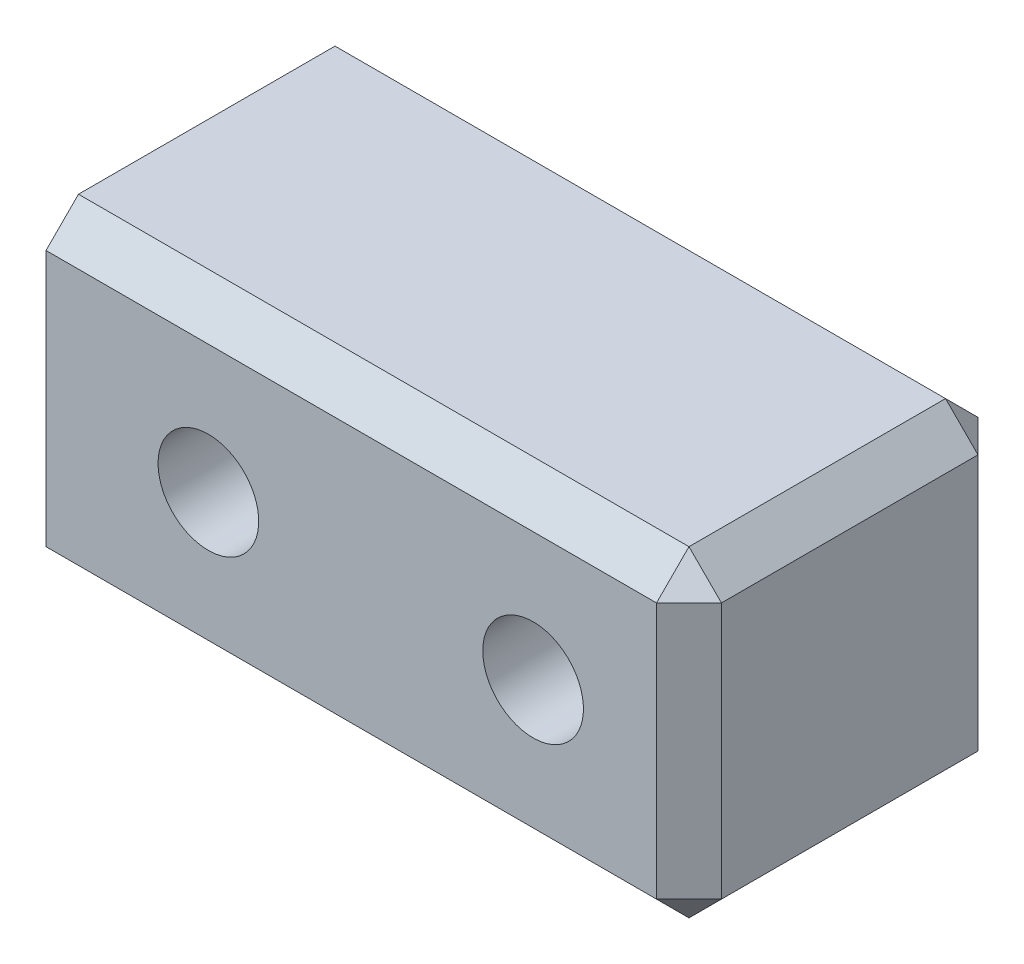
ISO-10303-21;
HEADER;
FILE_DESCRIPTION(('STEP AP214'),'2;1');
FILE_NAME('part.step','',(''),(''),'','','');
FILE_SCHEMA(('AUTOMOTIVE_DESIGN { 1 0 10303 214 1 1 1 1 }'));
ENDSEC;
DATA;
#1=APPLICATION_CONTEXT('core data for automotive mechanical design processes');
#2=APPLICATION_PROTOCOL_DEFINITION('international standard','automotive_design',2000,#1);
#3=PRODUCT_CONTEXT('',#1,'mechanical');
#4=PRODUCT('Part','Part','',(#3));
#5=PRODUCT_RELATED_PRODUCT_CATEGORY('part','',(#4));
#6=PRODUCT_DEFINITION_FORMATION('','',#4);
#7=PRODUCT_DEFINITION_CONTEXT('part definition',#1,'design');
#8=PRODUCT_DEFINITION('design','',#6,#7);
#9=PRODUCT_DEFINITION_SHAPE('','',#8);
#10=(LENGTH_UNIT() NAMED_UNIT(*) SI_UNIT(.MILLI.,.METRE.));
#11=(NAMED_UNIT(*) PLANE_ANGLE_UNIT() SI_UNIT($,.RADIAN.));
#12=(NAMED_UNIT(*) SI_UNIT($,.STERADIAN.) SOLID_ANGLE_UNIT());
#13=UNCERTAINTY_MEASURE_WITH_UNIT(LENGTH_MEASURE(1.E-05),#10,'distance_accuracy_value','');
#14=(GEOMETRIC_REPRESENTATION_CONTEXT(3) GLOBAL_UNCERTAINTY_ASSIGNED_CONTEXT((#13)) GLOBAL_UNIT_ASSIGNED_CONTEXT((#10,
#11,#12)) REPRESENTATION_CONTEXT('',''));
#15=CARTESIAN_POINT('',(0.,0.,0.));
#16=DIRECTION('',(0.,0.,1.));
#17=DIRECTION('',(1.,0.,0.));
#18=AXIS2_PLACEMENT_3D('',#15,#16,#17);
#19=CARTESIAN_POINT('',(0.,0.,9.9));
#20=DIRECTION('',(0.,0.,-1.));
#21=DIRECTION('',(-1.,0.,0.));
#22=AXIS2_PLACEMENT_3D('',#19,#20,#21);
#23=PLANE('',#22);
#24=DIRECTION('',(0.,-1.,0.));
#25=VECTOR('',#24,1.);
#26=CARTESIAN_POINT('',(0.,0.,9.9));
#27=LINE('',#26,#25);
#28=CARTESIAN_POINT('',(0.,8.9,9.9));
#29=VERTEX_POINT('',#28);
#30=CARTESIAN_POINT('',(0.,1.,9.9));
#31=VERTEX_POINT('',#30);
#32=EDGE_CURVE('E182',#29,#31,#27,.T.);
#33=ORIENTED_EDGE('',*,*,#32,.T.);
#34=DIRECTION('',(1.,0.,0.));
#35=VECTOR('',#34,1.);
#36=CARTESIAN_POINT('',(0.,1.,9.9));
#37=LINE('',#36,#35);
#38=CARTESIAN_POINT('',(18.8,1.,9.9));
#39=VERTEX_POINT('',#38);
#40=EDGE_CURVE('E205',#31,#39,#37,.T.);
#41=ORIENTED_EDGE('',*,*,#40,.T.);
#42=DIRECTION('',(0.,1.,0.));
#43=VECTOR('',#42,1.);
#44=CARTESIAN_POINT('',(18.8,0.,9.9));
#45=LINE('',#44,#43);
#46=CARTESIAN_POINT('',(18.8,8.9,9.9));
#47=VERTEX_POINT('',#46);
#48=EDGE_CURVE('E203',#39,#47,#45,.T.);
#49=ORIENTED_EDGE('',*,*,#48,.T.);
#50=DIRECTION('',(-1.,0.,0.));
#51=VECTOR('',#50,1.);
#52=CARTESIAN_POINT('',(0.,8.9,9.9));
#53=LINE('',#52,#51);
#54=EDGE_CURVE('E201',#47,#29,#53,.T.);
#55=ORIENTED_EDGE('',*,*,#54,.T.);
#56=EDGE_LOOP('',(#33,#41,#49,#55));
#57=FACE_BOUND('',#56,.T.);
#58=CARTESIAN_POINT('',(5.,4.95,9.9));
#59=DIRECTION('',(0.,0.,1.));
#60=DIRECTION('',(1.,0.,0.));
#61=AXIS2_PLACEMENT_3D('',#58,#59,#60);
#62=CIRCLE('',#61,1.55);
#63=CARTESIAN_POINT('',(3.45,4.95,9.9));
#64=VERTEX_POINT('',#63);
#65=EDGE_CURVE('E176',#64,#64,#62,.T.);
#66=ORIENTED_EDGE('',*,*,#65,.F.);
#67=EDGE_LOOP('',(#66));
#68=FACE_BOUND('',#67,.T.);
#69=CARTESIAN_POINT('',(15.,4.95,9.9));
#70=DIRECTION('',(0.,0.,1.));
#71=DIRECTION('',(1.,0.,0.));
#72=AXIS2_PLACEMENT_3D('',#69,#70,#71);
#73=CIRCLE('',#72,1.55);
#74=CARTESIAN_POINT('',(13.45,4.95,9.9));
#75=VERTEX_POINT('',#74);
#76=EDGE_CURVE('E168',#75,#75,#73,.T.);
#77=ORIENTED_EDGE('',*,*,#76,.F.);
#78=EDGE_LOOP('',(#77));
#79=FACE_BOUND('',#78,.T.);
#80=ADVANCED_FACE('F43',(#57,#68,#79),#23,.F.);
#81=CARTESIAN_POINT('',(0.,0.,0.));
#82=DIRECTION('',(0.,0.,-1.));
#83=DIRECTION('',(-1.,0.,0.));
#84=AXIS2_PLACEMENT_3D('',#81,#82,#83);
#85=PLANE('',#84);
#86=CARTESIAN_POINT('',(5.,4.95,0.));
#87=DIRECTION('',(0.,0.,1.));
#88=DIRECTION('',(1.,0.,0.));
#89=AXIS2_PLACEMENT_3D('',#86,#87,#88);
#90=CIRCLE('',#89,1.55);
#91=CARTESIAN_POINT('',(3.45,4.95,0.));
#92=VERTEX_POINT('',#91);
#93=EDGE_CURVE('E173',#92,#92,#90,.T.);
#94=ORIENTED_EDGE('',*,*,#93,.T.);
#95=EDGE_LOOP('',(#94));
#96=FACE_BOUND('',#95,.T.);
#97=DIRECTION('',(0.,-1.,0.));
#98=VECTOR('',#97,1.);
#99=CARTESIAN_POINT('',(18.8,0.,0.));
#100=LINE('',#99,#98);
#101=CARTESIAN_POINT('',(18.8,8.9,0.));
#102=VERTEX_POINT('',#101);
#103=CARTESIAN_POINT('',(18.8,1.,0.));
#104=VERTEX_POINT('',#103);
#105=EDGE_CURVE('E152',#102,#104,#100,.T.);
#106=ORIENTED_EDGE('',*,*,#105,.T.);
#107=DIRECTION('',(-1.,0.,0.));
#108=VECTOR('',#107,1.);
#109=CARTESIAN_POINT('',(0.,1.,0.));
#110=LINE('',#109,#108);
#111=CARTESIAN_POINT('',(0.,1.,0.));
#112=VERTEX_POINT('',#111);
#113=EDGE_CURVE('E218',#104,#112,#110,.T.);
#114=ORIENTED_EDGE('',*,*,#113,.T.);
#115=DIRECTION('',(0.,-1.,0.));
#116=VECTOR('',#115,1.);
#117=CARTESIAN_POINT('',(0.,0.,0.));
#118=LINE('',#117,#116);
#119=CARTESIAN_POINT('',(0.,8.9,0.));
#120=VERTEX_POINT('',#119);
#121=EDGE_CURVE('E179',#120,#112,#118,.T.);
#122=ORIENTED_EDGE('',*,*,#121,.F.);
#123=DIRECTION('',(1.,0.,0.));
#124=VECTOR('',#123,1.);
#125=CARTESIAN_POINT('',(19.8,8.9,0.));
#126=LINE('',#125,#124);
#127=EDGE_CURVE('E215',#120,#102,#126,.T.);
#128=ORIENTED_EDGE('',*,*,#127,.T.);
#129=EDGE_LOOP('',(#106,#114,#122,#128));
#130=FACE_BOUND('',#129,.T.);
#131=CARTESIAN_POINT('',(15.,4.95,0.));
#132=DIRECTION('',(0.,0.,1.));
#133=DIRECTION('',(1.,0.,0.));
#134=AXIS2_PLACEMENT_3D('',#131,#132,#133);
#135=CIRCLE('',#134,1.55);
#136=CARTESIAN_POINT('',(13.45,4.95,0.));
#137=VERTEX_POINT('',#136);
#138=EDGE_CURVE('E165',#137,#137,#135,.T.);
#139=ORIENTED_EDGE('',*,*,#138,.T.);
#140=EDGE_LOOP('',(#139));
#141=FACE_BOUND('',#140,.T.);
#142=ADVANCED_FACE('F265',(#96,#130,#141),#85,.T.);
#143=CARTESIAN_POINT('',(0.,0.,9.9));
#144=DIRECTION('',(1.,0.,0.));
#145=DIRECTION('',(0.,0.,-1.));
#146=AXIS2_PLACEMENT_3D('',#143,#144,#145);
#147=PLANE('',#146);
#148=DIRECTION('',(0.,0.,-1.));
#149=VECTOR('',#148,1.);
#150=CARTESIAN_POINT('',(0.,0.,9.9));
#151=LINE('',#150,#149);
#152=CARTESIAN_POINT('',(0.,0.,8.9));
#153=VERTEX_POINT('',#152);
#154=CARTESIAN_POINT('',(0.,0.,1.));
#155=VERTEX_POINT('',#154);
#156=EDGE_CURVE('E141',#153,#155,#151,.T.);
#157=ORIENTED_EDGE('',*,*,#156,.F.);
#158=DIRECTION('',(0.,-0.707106781186546,-0.707106781186549));
#159=VECTOR('',#158,1.);
#160=CARTESIAN_POINT('',(0.,1.,9.9));
#161=LINE('',#160,#159);
#162=EDGE_CURVE('E213',#153,#31,#161,.F.);
#163=ORIENTED_EDGE('',*,*,#162,.T.);
#164=ORIENTED_EDGE('',*,*,#32,.F.);
#165=DIRECTION('',(0.,-0.707106781186546,0.707106781186549));
#166=VECTOR('',#165,1.);
#167=CARTESIAN_POINT('',(0.,8.9,9.9));
#168=LINE('',#167,#166);
#169=CARTESIAN_POINT('',(0.,9.9,8.9));
#170=VERTEX_POINT('',#169);
#171=EDGE_CURVE('E207',#29,#170,#168,.F.);
#172=ORIENTED_EDGE('',*,*,#171,.T.);
#173=DIRECTION('',(0.,0.,-1.));
#174=VECTOR('',#173,1.);
#175=CARTESIAN_POINT('',(0.,9.9,9.9));
#176=LINE('',#175,#174);
#177=CARTESIAN_POINT('',(0.,9.9,1.00000000000001));
#178=VERTEX_POINT('',#177);
#179=EDGE_CURVE('E185',#170,#178,#176,.T.);
#180=ORIENTED_EDGE('',*,*,#179,.T.);
#181=DIRECTION('',(0.,-0.707106781186546,-0.707106781186549));
#182=VECTOR('',#181,1.);
#183=CARTESIAN_POINT('',(0.,9.9,1.));
#184=LINE('',#183,#182);
#185=EDGE_CURVE('E209',#178,#120,#184,.T.);
#186=ORIENTED_EDGE('',*,*,#185,.T.);
#187=ORIENTED_EDGE('',*,*,#121,.T.);
#188=DIRECTION('',(0.,-0.707106781186549,0.707106781186546));
#189=VECTOR('',#188,1.);
#190=CARTESIAN_POINT('',(0.,0.,1.));
#191=LINE('',#190,#189);
#192=EDGE_CURVE('E211',#112,#155,#191,.T.);
#193=ORIENTED_EDGE('',*,*,#192,.T.);
#194=EDGE_LOOP('',(#157,#163,#164,#172,#180,#186,#187,#193));
#195=FACE_BOUND('',#194,.T.);
#196=ADVANCED_FACE('F268',(#195),#147,.F.);
#197=CARTESIAN_POINT('',(0.,0.,9.9));
#198=DIRECTION('',(0.,1.,0.));
#199=DIRECTION('',(0.,0.,1.));
#200=AXIS2_PLACEMENT_3D('',#197,#198,#199);
#201=PLANE('',#200);
#202=DIRECTION('',(0.,0.,1.));
#203=VECTOR('',#202,1.);
#204=CARTESIAN_POINT('',(18.8,0.,9.9));
#205=LINE('',#204,#203);
#206=CARTESIAN_POINT('',(18.8,0.,1.));
#207=VERTEX_POINT('',#206);
#208=CARTESIAN_POINT('',(18.8,0.,8.9));
#209=VERTEX_POINT('',#208);
#210=EDGE_CURVE('E196',#207,#209,#205,.T.);
#211=ORIENTED_EDGE('',*,*,#210,.T.);
#212=DIRECTION('',(-1.,0.,0.));
#213=VECTOR('',#212,1.);
#214=CARTESIAN_POINT('',(0.,0.,8.9));
#215=LINE('',#214,#213);
#216=EDGE_CURVE('E199',#209,#153,#215,.T.);
#217=ORIENTED_EDGE('',*,*,#216,.T.);
#218=ORIENTED_EDGE('',*,*,#156,.T.);
#219=DIRECTION('',(1.,0.,0.));
#220=VECTOR('',#219,1.);
#221=CARTESIAN_POINT('',(19.8,0.,1.));
#222=LINE('',#221,#220);
#223=EDGE_CURVE('E194',#155,#207,#222,.T.);
#224=ORIENTED_EDGE('',*,*,#223,.T.);
#225=EDGE_LOOP('',(#211,#217,#218,#224));
#226=FACE_BOUND('',#225,.T.);
#227=ADVANCED_FACE('F251',(#226),#201,.F.);
#228=CARTESIAN_POINT('',(19.8,0.,9.9));
#229=DIRECTION('',(-1.,0.,0.));
#230=DIRECTION('',(0.,0.,1.));
#231=AXIS2_PLACEMENT_3D('',#228,#229,#230);
#232=PLANE('',#231);
#233=DIRECTION('',(0.,-1.,0.));
#234=VECTOR('',#233,1.);
#235=CARTESIAN_POINT('',(19.8,0.,8.9));
#236=LINE('',#235,#234);
#237=CARTESIAN_POINT('',(19.8,8.9,8.9));
#238=VERTEX_POINT('',#237);
#239=CARTESIAN_POINT('',(19.8,1.,8.9));
#240=VERTEX_POINT('',#239);
#241=EDGE_CURVE('E130',#238,#240,#236,.T.);
#242=ORIENTED_EDGE('',*,*,#241,.T.);
#243=DIRECTION('',(0.,0.,-1.));
#244=VECTOR('',#243,1.);
#245=CARTESIAN_POINT('',(19.8,1.,9.9));
#246=LINE('',#245,#244);
#247=CARTESIAN_POINT('',(19.8,1.,1.));
#248=VERTEX_POINT('',#247);
#249=EDGE_CURVE('E126',#240,#248,#246,.T.);
#250=ORIENTED_EDGE('',*,*,#249,.T.);
#251=DIRECTION('',(0.,1.,0.));
#252=VECTOR('',#251,1.);
#253=CARTESIAN_POINT('',(19.8,9.9,1.));
#254=LINE('',#253,#252);
#255=CARTESIAN_POINT('',(19.8,8.9,1.));
#256=VERTEX_POINT('',#255);
#257=EDGE_CURVE('E120',#248,#256,#254,.T.);
#258=ORIENTED_EDGE('',*,*,#257,.T.);
#259=DIRECTION('',(0.,0.,1.));
#260=VECTOR('',#259,1.);
#261=CARTESIAN_POINT('',(19.8,8.9,9.9));
#262=LINE('',#261,#260);
#263=EDGE_CURVE('E123',#256,#238,#262,.T.);
#264=ORIENTED_EDGE('',*,*,#263,.T.);
#265=EDGE_LOOP('',(#242,#250,#258,#264));
#266=FACE_BOUND('',#265,.T.);
#267=ADVANCED_FACE('F122',(#266),#232,.F.);
#268=CARTESIAN_POINT('',(0.,9.9,9.9));
#269=DIRECTION('',(0.,-1.,0.));
#270=DIRECTION('',(0.,0.,-1.));
#271=AXIS2_PLACEMENT_3D('',#268,#269,#270);
#272=PLANE('',#271);
#273=DIRECTION('',(0.,0.,-1.));
#274=VECTOR('',#273,1.);
#275=CARTESIAN_POINT('',(18.8,9.9,9.9));
#276=LINE('',#275,#274);
#277=CARTESIAN_POINT('',(18.8,9.9,8.9));
#278=VERTEX_POINT('',#277);
#279=CARTESIAN_POINT('',(18.8,9.9,1.));
#280=VERTEX_POINT('',#279);
#281=EDGE_CURVE('E53',#278,#280,#276,.T.);
#282=ORIENTED_EDGE('',*,*,#281,.T.);
#283=DIRECTION('',(-1.,0.,0.));
#284=VECTOR('',#283,1.);
#285=CARTESIAN_POINT('',(0.,9.9,1.));
#286=LINE('',#285,#284);
#287=EDGE_CURVE('E11',#280,#178,#286,.T.);
#288=ORIENTED_EDGE('',*,*,#287,.T.);
#289=ORIENTED_EDGE('',*,*,#179,.F.);
#290=DIRECTION('',(1.,0.,0.));
#291=VECTOR('',#290,1.);
#292=CARTESIAN_POINT('',(0.,9.9,8.9));
#293=LINE('',#292,#291);
#294=EDGE_CURVE('E64',#170,#278,#293,.T.);
#295=ORIENTED_EDGE('',*,*,#294,.T.);
#296=EDGE_LOOP('',(#282,#288,#289,#295));
#297=FACE_BOUND('',#296,.T.);
#298=ADVANCED_FACE('F272',(#297),#272,.F.);
#299=CARTESIAN_POINT('',(5.,4.95,9.9));
#300=DIRECTION('',(0.,0.,-1.));
#301=DIRECTION('',(-1.,0.,0.));
#302=AXIS2_PLACEMENT_3D('',#299,#300,#301);
#303=CYLINDRICAL_SURFACE('',#302,1.55);
#304=CARTESIAN_POINT('',(3.45,4.95,9.9));
#305=CARTESIAN_POINT('',(3.45,4.95,9.796875));
#306=CARTESIAN_POINT('',(3.45,4.95,9.69375));
#307=CARTESIAN_POINT('',(3.45,4.95,9.4875));
#308=CARTESIAN_POINT('',(3.45,4.95,9.384375));
#309=CARTESIAN_POINT('',(3.45,4.95,9.178125));
#310=CARTESIAN_POINT('',(3.45,4.95,9.075));
#311=CARTESIAN_POINT('',(3.45,4.95,8.86875));
#312=CARTESIAN_POINT('',(3.45,4.95,8.765625));
#313=CARTESIAN_POINT('',(3.45,4.95,8.559375));
#314=CARTESIAN_POINT('',(3.45,4.95,8.45625));
#315=CARTESIAN_POINT('',(3.45,4.95,8.25));
#316=CARTESIAN_POINT('',(3.45,4.95,8.146875));
#317=CARTESIAN_POINT('',(3.45,4.95,7.940625));
#318=CARTESIAN_POINT('',(3.45,4.95,7.8375));
#319=CARTESIAN_POINT('',(3.45,4.95,7.63125));
#320=CARTESIAN_POINT('',(3.45,4.95,7.528125));
#321=CARTESIAN_POINT('',(3.45,4.95,7.321875));
#322=CARTESIAN_POINT('',(3.45,4.95,7.21875));
#323=CARTESIAN_POINT('',(3.45,4.95,7.0125));
#324=CARTESIAN_POINT('',(3.45,4.95,6.909375));
#325=CARTESIAN_POINT('',(3.45,4.95,6.703125));
#326=CARTESIAN_POINT('',(3.45,4.95,6.6));
#327=CARTESIAN_POINT('',(3.45,4.95,6.39375));
#328=CARTESIAN_POINT('',(3.45,4.95,6.290625));
#329=CARTESIAN_POINT('',(3.45,4.95,6.084375));
#330=CARTESIAN_POINT('',(3.45,4.95,5.98125));
#331=CARTESIAN_POINT('',(3.45,4.95,5.775));
#332=CARTESIAN_POINT('',(3.45,4.95,5.671875));
#333=CARTESIAN_POINT('',(3.45,4.95,5.465625));
#334=CARTESIAN_POINT('',(3.45,4.95,5.3625));
#335=CARTESIAN_POINT('',(3.45,4.95,5.15625));
#336=CARTESIAN_POINT('',(3.45,4.95,5.053125));
#337=CARTESIAN_POINT('',(3.45,4.95,4.846875));
#338=CARTESIAN_POINT('',(3.45,4.95,4.74375));
#339=CARTESIAN_POINT('',(3.45,4.95,4.5375));
#340=CARTESIAN_POINT('',(3.45,4.95,4.434375));
#341=CARTESIAN_POINT('',(3.45,4.95,4.228125));
#342=CARTESIAN_POINT('',(3.45,4.95,4.125));
#343=CARTESIAN_POINT('',(3.45,4.95,3.91875));
#344=CARTESIAN_POINT('',(3.45,4.95,3.815625));
#345=CARTESIAN_POINT('',(3.45,4.95,3.609375));
#346=CARTESIAN_POINT('',(3.45,4.95,3.50625));
#347=CARTESIAN_POINT('',(3.45,4.95,3.3));
#348=CARTESIAN_POINT('',(3.45,4.95,3.196875));
#349=CARTESIAN_POINT('',(3.45,4.95,2.990625));
#350=CARTESIAN_POINT('',(3.45,4.95,2.8875));
#351=CARTESIAN_POINT('',(3.45,4.95,2.68125));
#352=CARTESIAN_POINT('',(3.45,4.95,2.578125));
#353=CARTESIAN_POINT('',(3.45,4.95,2.371875));
#354=CARTESIAN_POINT('',(3.45,4.95,2.26875));
#355=CARTESIAN_POINT('',(3.45,4.95,2.0625));
#356=CARTESIAN_POINT('',(3.45,4.95,1.959375));
#357=CARTESIAN_POINT('',(3.45,4.95,1.753125));
#358=CARTESIAN_POINT('',(3.45,4.95,1.65));
#359=CARTESIAN_POINT('',(3.45,4.95,1.44375));
#360=CARTESIAN_POINT('',(3.45,4.95,1.340625));
#361=CARTESIAN_POINT('',(3.45,4.95,1.134375));
#362=CARTESIAN_POINT('',(3.45,4.95,1.03125));
#363=CARTESIAN_POINT('',(3.45,4.95,0.825));
#364=CARTESIAN_POINT('',(3.45,4.95,0.721875));
#365=CARTESIAN_POINT('',(3.45,4.95,0.515625));
#366=CARTESIAN_POINT('',(3.45,4.95,0.4125));
#367=CARTESIAN_POINT('',(3.45,4.95,0.20625));
#368=CARTESIAN_POINT('',(3.45,4.95,0.103125));
#369=CARTESIAN_POINT('',(3.45,4.95,0.));
#370=B_SPLINE_CURVE_WITH_KNOTS('',3,(#304,#305,#306,#307,#308,#309,#310,#311,#312,#313,#314,
#315,#316,#317,#318,#319,#320,#321,#322,#323,#324,#325,#326,#327,#328,#329,#330,#331,#332,#333,
#334,#335,#336,#337,#338,#339,#340,#341,#342,#343,#344,#345,#346,#347,#348,#349,#350,#351,#352,
#353,#354,#355,#356,#357,#358,#359,#360,#361,#362,#363,#364,#365,#366,#367,#368,#369),
.UNSPECIFIED.,.F.,.F.,(4,2,2,2,2,2,2,2,2,2,2,2,2,2,2,2,2,2,2,2,2,2,2,2,2,2,2,2,2,2,2,2,4),(0.,
0.309375000000001,0.618750000000001,0.928125,1.2375,1.546875,1.85625,2.165625,2.475,2.784375,
3.09375,3.403125,3.7125,4.021875,4.33125,4.640625,4.95,5.259375,5.56875,5.878125,6.1875,
6.496875,6.80625,7.115625,7.425,7.734375,8.04375,8.353125,8.6625,8.971875,9.28125,9.590625,9.9),.UNSPECIFIED.);
#371=EDGE_CURVE('BSEAM286',#64,#92,#370,.T.);
#372=ORIENTED_EDGE('',*,*,#65,.T.);
#373=ORIENTED_EDGE('',*,*,#93,.F.);
#374=ORIENTED_EDGE('',*,*,#371,.T.);
#375=ORIENTED_EDGE('',*,*,#371,.F.);
#376=EDGE_LOOP('',(#372,#374,#373,#375));
#377=FACE_BOUND('',#376,.T.);
#378=ADVANCED_FACE('F286',(#377),#303,.F.);
#379=CARTESIAN_POINT('',(15.,4.95,9.9));
#380=DIRECTION('',(0.,0.,-1.));
#381=DIRECTION('',(-1.,0.,0.));
#382=AXIS2_PLACEMENT_3D('',#379,#380,#381);
#383=CYLINDRICAL_SURFACE('',#382,1.55);
#384=CARTESIAN_POINT('',(13.45,4.95,9.9));
#385=CARTESIAN_POINT('',(13.45,4.95,9.796875));
#386=CARTESIAN_POINT('',(13.45,4.95,9.69375));
#387=CARTESIAN_POINT('',(13.45,4.95,9.4875));
#388=CARTESIAN_POINT('',(13.45,4.95,9.384375));
#389=CARTESIAN_POINT('',(13.45,4.95,9.178125));
#390=CARTESIAN_POINT('',(13.45,4.95,9.075));
#391=CARTESIAN_POINT('',(13.45,4.95,8.86875));
#392=CARTESIAN_POINT('',(13.45,4.95,8.765625));
#393=CARTESIAN_POINT('',(13.45,4.95,8.559375));
#394=CARTESIAN_POINT('',(13.45,4.95,8.45625));
#395=CARTESIAN_POINT('',(13.45,4.95,8.25));
#396=CARTESIAN_POINT('',(13.45,4.95,8.146875));
#397=CARTESIAN_POINT('',(13.45,4.95,7.940625));
#398=CARTESIAN_POINT('',(13.45,4.95,7.8375));
#399=CARTESIAN_POINT('',(13.45,4.95,7.63125));
#400=CARTESIAN_POINT('',(13.45,4.95,7.528125));
#401=CARTESIAN_POINT('',(13.45,4.95,7.321875));
#402=CARTESIAN_POINT('',(13.45,4.95,7.21875));
#403=CARTESIAN_POINT('',(13.45,4.95,7.0125));
#404=CARTESIAN_POINT('',(13.45,4.95,6.909375));
#405=CARTESIAN_POINT('',(13.45,4.95,6.703125));
#406=CARTESIAN_POINT('',(13.45,4.95,6.6));
#407=CARTESIAN_POINT('',(13.45,4.95,6.39375));
#408=CARTESIAN_POINT('',(13.45,4.95,6.290625));
#409=CARTESIAN_POINT('',(13.45,4.95,6.084375));
#410=CARTESIAN_POINT('',(13.45,4.95,5.98125));
#411=CARTESIAN_POINT('',(13.45,4.95,5.775));
#412=CARTESIAN_POINT('',(13.45,4.95,5.671875));
#413=CARTESIAN_POINT('',(13.45,4.95,5.465625));
#414=CARTESIAN_POINT('',(13.45,4.95,5.3625));
#415=CARTESIAN_POINT('',(13.45,4.95,5.15625));
#416=CARTESIAN_POINT('',(13.45,4.95,5.053125));
#417=CARTESIAN_POINT('',(13.45,4.95,4.846875));
#418=CARTESIAN_POINT('',(13.45,4.95,4.74375));
#419=CARTESIAN_POINT('',(13.45,4.95,4.5375));
#420=CARTESIAN_POINT('',(13.45,4.95,4.434375));
#421=CARTESIAN_POINT('',(13.45,4.95,4.228125));
#422=CARTESIAN_POINT('',(13.45,4.95,4.125));
#423=CARTESIAN_POINT('',(13.45,4.95,3.91875));
#424=CARTESIAN_POINT('',(13.45,4.95,3.815625));
#425=CARTESIAN_POINT('',(13.45,4.95,3.609375));
#426=CARTESIAN_POINT('',(13.45,4.95,3.50625));
#427=CARTESIAN_POINT('',(13.45,4.95,3.3));
#428=CARTESIAN_POINT('',(13.45,4.95,3.196875));
#429=CARTESIAN_POINT('',(13.45,4.95,2.990625));
#430=CARTESIAN_POINT('',(13.45,4.95,2.8875));
#431=CARTESIAN_POINT('',(13.45,4.95,2.68125));
#432=CARTESIAN_POINT('',(13.45,4.95,2.578125));
#433=CARTESIAN_POINT('',(13.45,4.95,2.371875));
#434=CARTESIAN_POINT('',(13.45,4.95,2.26875));
#435=CARTESIAN_POINT('',(13.45,4.95,2.0625));
#436=CARTESIAN_POINT('',(13.45,4.95,1.959375));
#437=CARTESIAN_POINT('',(13.45,4.95,1.753125));
#438=CARTESIAN_POINT('',(13.45,4.95,1.65));
#439=CARTESIAN_POINT('',(13.45,4.95,1.44375));
#440=CARTESIAN_POINT('',(13.45,4.95,1.340625));
#441=CARTESIAN_POINT('',(13.45,4.95,1.134375));
#442=CARTESIAN_POINT('',(13.45,4.95,1.03125));
#443=CARTESIAN_POINT('',(13.45,4.95,0.825));
#444=CARTESIAN_POINT('',(13.45,4.95,0.721875));
#445=CARTESIAN_POINT('',(13.45,4.95,0.515625));
#446=CARTESIAN_POINT('',(13.45,4.95,0.4125));
#447=CARTESIAN_POINT('',(13.45,4.95,0.20625));
#448=CARTESIAN_POINT('',(13.45,4.95,0.103125));
#449=CARTESIAN_POINT('',(13.45,4.95,0.));
#450=B_SPLINE_CURVE_WITH_KNOTS('',3,(#384,#385,#386,#387,#388,#389,#390,#391,#392,#393,#394,
#395,#396,#397,#398,#399,#400,#401,#402,#403,#404,#405,#406,#407,#408,#409,#410,#411,#412,#413,
#414,#415,#416,#417,#418,#419,#420,#421,#422,#423,#424,#425,#426,#427,#428,#429,#430,#431,#432,
#433,#434,#435,#436,#437,#438,#439,#440,#441,#442,#443,#444,#445,#446,#447,#448,#449),
.UNSPECIFIED.,.F.,.F.,(4,2,2,2,2,2,2,2,2,2,2,2,2,2,2,2,2,2,2,2,2,2,2,2,2,2,2,2,2,2,2,2,4),(0.,
0.309375000000001,0.618750000000001,0.928125,1.2375,1.546875,1.85625,2.165625,2.475,2.784375,
3.09375,3.403125,3.7125,4.021875,4.33125,4.640625,4.95,5.259375,5.56875,5.878125,6.1875,
6.496875,6.80625,7.115625,7.425,7.734375,8.04375,8.353125,8.6625,8.971875,9.28125,9.590625,9.9),.UNSPECIFIED.);
#451=EDGE_CURVE('BSEAM283',#75,#137,#450,.T.);
#452=ORIENTED_EDGE('',*,*,#76,.T.);
#453=ORIENTED_EDGE('',*,*,#138,.F.);
#454=ORIENTED_EDGE('',*,*,#451,.T.);
#455=ORIENTED_EDGE('',*,*,#451,.F.);
#456=EDGE_LOOP('',(#452,#454,#453,#455));
#457=FACE_BOUND('',#456,.T.);
#458=ADVANCED_FACE('F283',(#457),#383,.F.);
#459=CARTESIAN_POINT('',(0.,8.9,9.9));
#460=DIRECTION('',(0.,-0.707106781186549,-0.707106781186546));
#461=DIRECTION('',(-1.,0.,0.));
#462=AXIS2_PLACEMENT_3D('',#459,#460,#461);
#463=PLANE('',#462);
#464=ORIENTED_EDGE('',*,*,#171,.F.);
#465=ORIENTED_EDGE('',*,*,#54,.F.);
#466=DIRECTION('',(0.,0.707106781186546,-0.707106781186549));
#467=VECTOR('',#466,1.);
#468=CARTESIAN_POINT('',(18.8,8.9,9.9));
#469=LINE('',#468,#467);
#470=EDGE_CURVE('E48',#278,#47,#469,.F.);
#471=ORIENTED_EDGE('',*,*,#470,.F.);
#472=ORIENTED_EDGE('',*,*,#294,.F.);
#473=EDGE_LOOP('',(#464,#465,#471,#472));
#474=FACE_BOUND('',#473,.T.);
#475=ADVANCED_FACE('F46',(#474),#463,.F.);
#476=CARTESIAN_POINT('',(18.8,9.9,9.9));
#477=DIRECTION('',(-0.707106781186546,-0.707106781186549,0.));
#478=DIRECTION('',(0.,0.,-1.));
#479=AXIS2_PLACEMENT_3D('',#476,#477,#478);
#480=PLANE('',#479);
#481=DIRECTION('',(-0.707106781186549,0.707106781186546,0.));
#482=VECTOR('',#481,1.);
#483=CARTESIAN_POINT('',(19.8,8.9,1.));
#484=LINE('',#483,#482);
#485=EDGE_CURVE('E136',#280,#256,#484,.F.);
#486=ORIENTED_EDGE('',*,*,#485,.F.);
#487=ORIENTED_EDGE('',*,*,#281,.F.);
#488=DIRECTION('',(0.707106781186549,-0.707106781186546,0.));
#489=VECTOR('',#488,1.);
#490=CARTESIAN_POINT('',(19.3,9.4,8.9));
#491=LINE('',#490,#489);
#492=EDGE_CURVE('E139',#238,#278,#491,.F.);
#493=ORIENTED_EDGE('',*,*,#492,.F.);
#494=ORIENTED_EDGE('',*,*,#263,.F.);
#495=EDGE_LOOP('',(#486,#487,#493,#494));
#496=FACE_BOUND('',#495,.T.);
#497=ADVANCED_FACE('F135',(#496),#480,.F.);
#498=CARTESIAN_POINT('',(0.,9.9,1.));
#499=DIRECTION('',(0.,0.707106781186549,-0.707106781186546));
#500=DIRECTION('',(1.,0.,0.));
#501=AXIS2_PLACEMENT_3D('',#498,#499,#500);
#502=PLANE('',#501);
#503=ORIENTED_EDGE('',*,*,#185,.F.);
#504=ORIENTED_EDGE('',*,*,#287,.F.);
#505=DIRECTION('',(0.,0.707106781186546,0.707106781186549));
#506=VECTOR('',#505,1.);
#507=CARTESIAN_POINT('',(18.8,9.4,0.500000000000002));
#508=LINE('',#507,#506);
#509=EDGE_CURVE('E149',#102,#280,#508,.T.);
#510=ORIENTED_EDGE('',*,*,#509,.F.);
#511=ORIENTED_EDGE('',*,*,#127,.F.);
#512=EDGE_LOOP('',(#503,#504,#510,#511));
#513=FACE_BOUND('',#512,.T.);
#514=ADVANCED_FACE('F271',(#513),#502,.T.);
#515=CARTESIAN_POINT('',(18.8,8.9,9.9));
#516=DIRECTION('',(0.577350269189626,0.577350269189628,0.577350269189624));
#517=DIRECTION('',(-0.707106781186549,0.707106781186546,0.));
#518=AXIS2_PLACEMENT_3D('',#515,#516,#517);
#519=PLANE('',#518);
#520=ORIENTED_EDGE('',*,*,#492,.T.);
#521=ORIENTED_EDGE('',*,*,#470,.T.);
#522=DIRECTION('',(-0.707106781186546,0.,0.707106781186549));
#523=VECTOR('',#522,1.);
#524=CARTESIAN_POINT('',(18.8,8.9,9.9));
#525=LINE('',#524,#523);
#526=EDGE_CURVE('E153',#238,#47,#525,.T.);
#527=ORIENTED_EDGE('',*,*,#526,.F.);
#528=EDGE_LOOP('',(#520,#521,#527));
#529=FACE_BOUND('',#528,.T.);
#530=ADVANCED_FACE('F347',(#529),#519,.T.);
#531=CARTESIAN_POINT('',(19.8,8.9,1.));
#532=DIRECTION('',(0.577350269189624,0.577350269189628,-0.577350269189626));
#533=DIRECTION('',(0.,0.707106781186546,0.707106781186549));
#534=AXIS2_PLACEMENT_3D('',#531,#532,#533);
#535=PLANE('',#534);
#536=ORIENTED_EDGE('',*,*,#509,.T.);
#537=ORIENTED_EDGE('',*,*,#485,.T.);
#538=DIRECTION('',(-0.707106781186549,0.,-0.707106781186546));
#539=VECTOR('',#538,1.);
#540=CARTESIAN_POINT('',(19.8,8.9,1.));
#541=LINE('',#540,#539);
#542=EDGE_CURVE('E146',#102,#256,#541,.F.);
#543=ORIENTED_EDGE('',*,*,#542,.F.);
#544=EDGE_LOOP('',(#536,#537,#543));
#545=FACE_BOUND('',#544,.T.);
#546=ADVANCED_FACE('F145',(#545),#535,.T.);
#547=CARTESIAN_POINT('',(0.,1.,9.9));
#548=DIRECTION('',(0.,0.707106781186549,-0.707106781186546));
#549=DIRECTION('',(1.,0.,0.));
#550=AXIS2_PLACEMENT_3D('',#547,#548,#549);
#551=PLANE('',#550);
#552=ORIENTED_EDGE('',*,*,#162,.F.);
#553=ORIENTED_EDGE('',*,*,#216,.F.);
#554=DIRECTION('',(0.,0.707106781186546,0.707106781186549));
#555=VECTOR('',#554,1.);
#556=CARTESIAN_POINT('',(18.8,0.,8.9));
#557=LINE('',#556,#555);
#558=EDGE_CURVE('E154',#39,#209,#557,.F.);
#559=ORIENTED_EDGE('',*,*,#558,.F.);
#560=ORIENTED_EDGE('',*,*,#40,.F.);
#561=EDGE_LOOP('',(#552,#553,#559,#560));
#562=FACE_BOUND('',#561,.T.);
#563=ADVANCED_FACE('F247',(#562),#551,.F.);
#564=CARTESIAN_POINT('',(18.8,0.,9.9));
#565=DIRECTION('',(-0.707106781186549,0.,-0.707106781186546));
#566=DIRECTION('',(0.,1.,0.));
#567=AXIS2_PLACEMENT_3D('',#564,#565,#566);
#568=PLANE('',#567);
#569=ORIENTED_EDGE('',*,*,#526,.T.);
#570=ORIENTED_EDGE('',*,*,#48,.F.);
#571=DIRECTION('',(0.707106781186546,0.,-0.707106781186549));
#572=VECTOR('',#571,1.);
#573=CARTESIAN_POINT('',(19.3,1.,9.4));
#574=LINE('',#573,#572);
#575=EDGE_CURVE('E159',#240,#39,#574,.F.);
#576=ORIENTED_EDGE('',*,*,#575,.F.);
#577=ORIENTED_EDGE('',*,*,#241,.F.);
#578=EDGE_LOOP('',(#569,#570,#576,#577));
#579=FACE_BOUND('',#578,.T.);
#580=ADVANCED_FACE('F241',(#579),#568,.F.);
#581=CARTESIAN_POINT('',(19.8,0.,1.));
#582=DIRECTION('',(0.707106781186546,0.,-0.707106781186549));
#583=DIRECTION('',(0.,-1.,0.));
#584=AXIS2_PLACEMENT_3D('',#581,#582,#583);
#585=PLANE('',#584);
#586=ORIENTED_EDGE('',*,*,#542,.T.);
#587=ORIENTED_EDGE('',*,*,#257,.F.);
#588=DIRECTION('',(0.707106781186549,0.,0.707106781186546));
#589=VECTOR('',#588,1.);
#590=CARTESIAN_POINT('',(19.8,1.,1.));
#591=LINE('',#590,#589);
#592=EDGE_CURVE('E229',#104,#248,#591,.T.);
#593=ORIENTED_EDGE('',*,*,#592,.F.);
#594=ORIENTED_EDGE('',*,*,#105,.F.);
#595=EDGE_LOOP('',(#586,#587,#593,#594));
#596=FACE_BOUND('',#595,.T.);
#597=ADVANCED_FACE('F151',(#596),#585,.T.);
#598=CARTESIAN_POINT('',(0.,0.,1.));
#599=DIRECTION('',(0.,-0.707106781186546,-0.707106781186549));
#600=DIRECTION('',(-1.,0.,0.));
#601=AXIS2_PLACEMENT_3D('',#598,#599,#600);
#602=PLANE('',#601);
#603=ORIENTED_EDGE('',*,*,#192,.F.);
#604=ORIENTED_EDGE('',*,*,#113,.F.);
#605=DIRECTION('',(0.,0.707106781186549,-0.707106781186546));
#606=VECTOR('',#605,1.);
#607=CARTESIAN_POINT('',(18.8,0.500000000000002,0.5));
#608=LINE('',#607,#606);
#609=EDGE_CURVE('E226',#207,#104,#608,.T.);
#610=ORIENTED_EDGE('',*,*,#609,.F.);
#611=ORIENTED_EDGE('',*,*,#223,.F.);
#612=EDGE_LOOP('',(#603,#604,#610,#611));
#613=FACE_BOUND('',#612,.T.);
#614=ADVANCED_FACE('F262',(#613),#602,.T.);
#615=CARTESIAN_POINT('',(18.8,0.,8.9));
#616=DIRECTION('',(0.577350269189626,-0.577350269189628,0.577350269189624));
#617=DIRECTION('',(0.707106781186549,0.707106781186546,0.));
#618=AXIS2_PLACEMENT_3D('',#615,#616,#617);
#619=PLANE('',#618);
#620=ORIENTED_EDGE('',*,*,#575,.T.);
#621=ORIENTED_EDGE('',*,*,#558,.T.);
#622=DIRECTION('',(-0.707106781186549,-0.707106781186546,0.));
#623=VECTOR('',#622,1.);
#624=CARTESIAN_POINT('',(18.8,0.,8.9));
#625=LINE('',#624,#623);
#626=EDGE_CURVE('E224',#240,#209,#625,.T.);
#627=ORIENTED_EDGE('',*,*,#626,.F.);
#628=EDGE_LOOP('',(#620,#621,#627));
#629=FACE_BOUND('',#628,.T.);
#630=ADVANCED_FACE('F235',(#629),#619,.T.);
#631=CARTESIAN_POINT('',(19.8,1.,1.));
#632=DIRECTION('',(0.577350269189624,-0.577350269189626,-0.577350269189628));
#633=DIRECTION('',(0.,0.707106781186549,-0.707106781186546));
#634=AXIS2_PLACEMENT_3D('',#631,#632,#633);
#635=PLANE('',#634);
#636=ORIENTED_EDGE('',*,*,#609,.T.);
#637=ORIENTED_EDGE('',*,*,#592,.T.);
#638=DIRECTION('',(0.707106781186549,0.707106781186546,0.));
#639=VECTOR('',#638,1.);
#640=CARTESIAN_POINT('',(19.8,1.,1.));
#641=LINE('',#640,#639);
#642=EDGE_CURVE('E222',#207,#248,#641,.T.);
#643=ORIENTED_EDGE('',*,*,#642,.F.);
#644=EDGE_LOOP('',(#636,#637,#643));
#645=FACE_BOUND('',#644,.T.);
#646=ADVANCED_FACE('F258',(#645),#635,.T.);
#647=CARTESIAN_POINT('',(19.8,1.,9.9));
#648=DIRECTION('',(-0.707106781186546,0.707106781186549,0.));
#649=DIRECTION('',(0.,0.,-1.));
#650=AXIS2_PLACEMENT_3D('',#647,#648,#649);
#651=PLANE('',#650);
#652=ORIENTED_EDGE('',*,*,#626,.T.);
#653=ORIENTED_EDGE('',*,*,#210,.F.);
#654=ORIENTED_EDGE('',*,*,#642,.T.);
#655=ORIENTED_EDGE('',*,*,#249,.F.);
#656=EDGE_LOOP('',(#652,#653,#654,#655));
#657=FACE_BOUND('',#656,.T.);
#658=ADVANCED_FACE('F256',(#657),#651,.F.);
#659=CLOSED_SHELL('',(#80,#142,#196,#227,#267,#298,#378,#458,#475,#497,#514,#530,#546,#563,#580,
#597,#614,#630,#646,#658));
#660=MANIFOLD_SOLID_BREP('B2',#659);
#661=ADVANCED_BREP_SHAPE_REPRESENTATION('',(#18,#660),#14);
#662=SHAPE_DEFINITION_REPRESENTATION(#9,#661);
ENDSEC;
END-ISO-10303-21;
